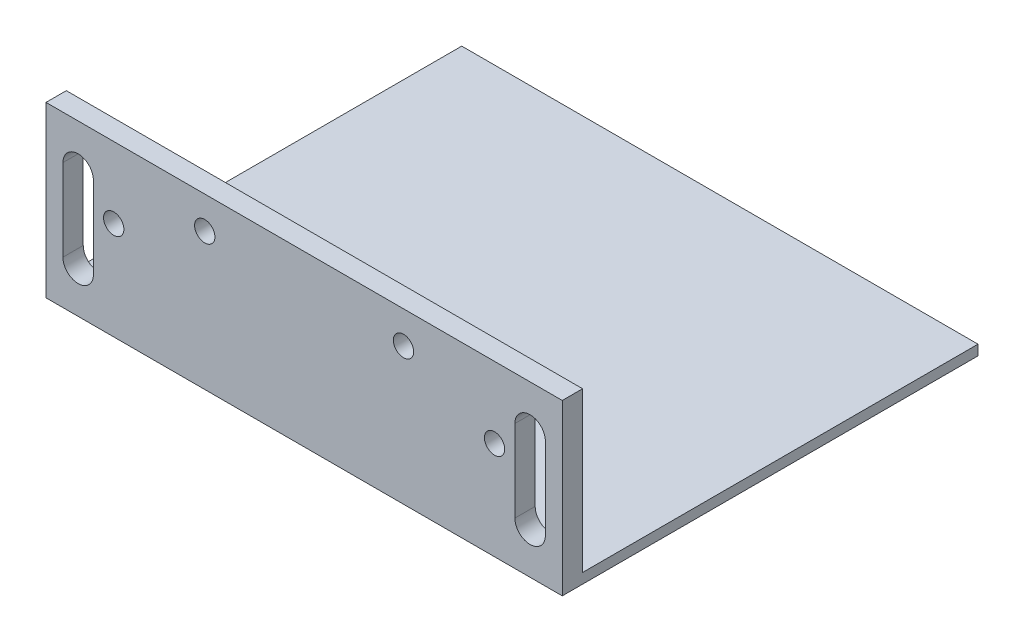
ISO-10303-21;
HEADER;
FILE_DESCRIPTION(('STEP AP214'),'2;1');
FILE_NAME('part.step','',(''),(''),'','','');
FILE_SCHEMA(('AUTOMOTIVE_DESIGN { 1 0 10303 214 1 1 1 1 }'));
ENDSEC;
DATA;
#1=APPLICATION_CONTEXT('core data for automotive mechanical design processes');
#2=APPLICATION_PROTOCOL_DEFINITION('international standard','automotive_design',2000,#1);
#3=PRODUCT_CONTEXT('',#1,'mechanical');
#4=PRODUCT('Part','Part','',(#3));
#5=PRODUCT_RELATED_PRODUCT_CATEGORY('part','',(#4));
#6=PRODUCT_DEFINITION_FORMATION('','',#4);
#7=PRODUCT_DEFINITION_CONTEXT('part definition',#1,'design');
#8=PRODUCT_DEFINITION('design','',#6,#7);
#9=PRODUCT_DEFINITION_SHAPE('','',#8);
#10=(LENGTH_UNIT() NAMED_UNIT(*) SI_UNIT(.MILLI.,.METRE.));
#11=(NAMED_UNIT(*) PLANE_ANGLE_UNIT() SI_UNIT($,.RADIAN.));
#12=(NAMED_UNIT(*) SI_UNIT($,.STERADIAN.) SOLID_ANGLE_UNIT());
#13=UNCERTAINTY_MEASURE_WITH_UNIT(LENGTH_MEASURE(1.E-05),#10,'distance_accuracy_value','');
#14=(GEOMETRIC_REPRESENTATION_CONTEXT(3) GLOBAL_UNCERTAINTY_ASSIGNED_CONTEXT((#13)) GLOBAL_UNIT_ASSIGNED_CONTEXT((#10,
#11,#12)) REPRESENTATION_CONTEXT('',''));
#15=CARTESIAN_POINT('',(0.,0.,0.));
#16=DIRECTION('',(0.,0.,1.));
#17=DIRECTION('',(1.,0.,0.));
#18=AXIS2_PLACEMENT_3D('',#15,#16,#17);
#19=CARTESIAN_POINT('',(-38.125,1.5,29.2));
#20=DIRECTION('',(1.,0.,0.));
#21=DIRECTION('',(0.,0.,-1.));
#22=AXIS2_PLACEMENT_3D('',#19,#20,#21);
#23=PLANE('',#22);
#24=DIRECTION('',(0.,0.,1.));
#25=VECTOR('',#24,1.);
#26=CARTESIAN_POINT('',(-38.125,0.,29.2));
#27=LINE('',#26,#25);
#28=CARTESIAN_POINT('',(-38.125,0.,-29.2));
#29=VERTEX_POINT('',#28);
#30=CARTESIAN_POINT('',(-38.125,0.,32.2));
#31=VERTEX_POINT('',#30);
#32=EDGE_CURVE('E247',#29,#31,#27,.T.);
#33=ORIENTED_EDGE('',*,*,#32,.T.);
#34=DIRECTION('',(0.,-1.,0.));
#35=VECTOR('',#34,1.);
#36=CARTESIAN_POINT('',(-38.125,0.,32.2));
#37=LINE('',#36,#35);
#38=CARTESIAN_POINT('',(-38.125,25.,32.2));
#39=VERTEX_POINT('',#38);
#40=EDGE_CURVE('E225',#39,#31,#37,.T.);
#41=ORIENTED_EDGE('',*,*,#40,.F.);
#42=DIRECTION('',(0.,0.,-1.));
#43=VECTOR('',#42,1.);
#44=CARTESIAN_POINT('',(-38.125,25.,32.2));
#45=LINE('',#44,#43);
#46=CARTESIAN_POINT('',(-38.125,25.,29.2));
#47=VERTEX_POINT('',#46);
#48=EDGE_CURVE('E236',#39,#47,#45,.T.);
#49=ORIENTED_EDGE('',*,*,#48,.T.);
#50=DIRECTION('',(0.,-1.,0.));
#51=VECTOR('',#50,1.);
#52=CARTESIAN_POINT('',(-38.125,0.,29.2));
#53=LINE('',#52,#51);
#54=CARTESIAN_POINT('',(-38.125,1.5,29.2));
#55=VERTEX_POINT('',#54);
#56=EDGE_CURVE('E224',#47,#55,#53,.T.);
#57=ORIENTED_EDGE('',*,*,#56,.T.);
#58=DIRECTION('',(0.,0.,1.));
#59=VECTOR('',#58,1.);
#60=CARTESIAN_POINT('',(-38.125,1.5,29.2));
#61=LINE('',#60,#59);
#62=CARTESIAN_POINT('',(-38.125,1.5,-29.2));
#63=VERTEX_POINT('',#62);
#64=EDGE_CURVE('E248',#63,#55,#61,.T.);
#65=ORIENTED_EDGE('',*,*,#64,.F.);
#66=DIRECTION('',(0.,-1.,0.));
#67=VECTOR('',#66,1.);
#68=CARTESIAN_POINT('',(-38.125,1.5,-29.2));
#69=LINE('',#68,#67);
#70=EDGE_CURVE('E43',#63,#29,#69,.T.);
#71=ORIENTED_EDGE('',*,*,#70,.T.);
#72=EDGE_LOOP('',(#33,#41,#49,#57,#65,#71));
#73=FACE_BOUND('',#72,.T.);
#74=ADVANCED_FACE('F36',(#73),#23,.F.);
#75=CARTESIAN_POINT('',(38.125,1.5,29.2));
#76=DIRECTION('',(-1.,0.,0.));
#77=DIRECTION('',(0.,0.,1.));
#78=AXIS2_PLACEMENT_3D('',#75,#76,#77);
#79=PLANE('',#78);
#80=DIRECTION('',(0.,0.,-1.));
#81=VECTOR('',#80,1.);
#82=CARTESIAN_POINT('',(38.125,0.,29.2));
#83=LINE('',#82,#81);
#84=CARTESIAN_POINT('',(38.125,0.,32.2));
#85=VERTEX_POINT('',#84);
#86=CARTESIAN_POINT('',(38.125,0.,-29.2));
#87=VERTEX_POINT('',#86);
#88=EDGE_CURVE('E260',#85,#87,#83,.T.);
#89=ORIENTED_EDGE('',*,*,#88,.T.);
#90=DIRECTION('',(0.,-1.,0.));
#91=VECTOR('',#90,1.);
#92=CARTESIAN_POINT('',(38.125,1.5,-29.2));
#93=LINE('',#92,#91);
#94=CARTESIAN_POINT('',(38.125,1.5,-29.2));
#95=VERTEX_POINT('',#94);
#96=EDGE_CURVE('E11',#95,#87,#93,.T.);
#97=ORIENTED_EDGE('',*,*,#96,.F.);
#98=DIRECTION('',(0.,0.,-1.));
#99=VECTOR('',#98,1.);
#100=CARTESIAN_POINT('',(38.125,1.5,29.2));
#101=LINE('',#100,#99);
#102=CARTESIAN_POINT('',(38.125,1.5,29.2));
#103=VERTEX_POINT('',#102);
#104=EDGE_CURVE('E255',#103,#95,#101,.T.);
#105=ORIENTED_EDGE('',*,*,#104,.F.);
#106=DIRECTION('',(0.,1.,0.));
#107=VECTOR('',#106,1.);
#108=CARTESIAN_POINT('',(38.125,0.,29.2));
#109=LINE('',#108,#107);
#110=CARTESIAN_POINT('',(38.125,25.,29.2));
#111=VERTEX_POINT('',#110);
#112=EDGE_CURVE('E239',#103,#111,#109,.T.);
#113=ORIENTED_EDGE('',*,*,#112,.T.);
#114=DIRECTION('',(0.,0.,-1.));
#115=VECTOR('',#114,1.);
#116=CARTESIAN_POINT('',(38.125,25.,32.2));
#117=LINE('',#116,#115);
#118=CARTESIAN_POINT('',(38.125,25.,32.2));
#119=VERTEX_POINT('',#118);
#120=EDGE_CURVE('E244',#119,#111,#117,.T.);
#121=ORIENTED_EDGE('',*,*,#120,.F.);
#122=DIRECTION('',(0.,1.,0.));
#123=VECTOR('',#122,1.);
#124=CARTESIAN_POINT('',(38.125,0.,32.2));
#125=LINE('',#124,#123);
#126=EDGE_CURVE('E232',#85,#119,#125,.T.);
#127=ORIENTED_EDGE('',*,*,#126,.F.);
#128=EDGE_LOOP('',(#89,#97,#105,#113,#121,#127));
#129=FACE_BOUND('',#128,.T.);
#130=ADVANCED_FACE('F288',(#129),#79,.F.);
#131=CARTESIAN_POINT('',(38.125,1.5,-29.2));
#132=DIRECTION('',(0.,0.,1.));
#133=DIRECTION('',(1.,0.,0.));
#134=AXIS2_PLACEMENT_3D('',#131,#132,#133);
#135=PLANE('',#134);
#136=DIRECTION('',(-1.,0.,0.));
#137=VECTOR('',#136,1.);
#138=CARTESIAN_POINT('',(38.125,0.,-29.2));
#139=LINE('',#138,#137);
#140=EDGE_CURVE('E252',#87,#29,#139,.T.);
#141=ORIENTED_EDGE('',*,*,#140,.T.);
#142=ORIENTED_EDGE('',*,*,#70,.F.);
#143=DIRECTION('',(-1.,0.,0.));
#144=VECTOR('',#143,1.);
#145=CARTESIAN_POINT('',(38.125,1.5,-29.2));
#146=LINE('',#145,#144);
#147=EDGE_CURVE('E257',#95,#63,#146,.T.);
#148=ORIENTED_EDGE('',*,*,#147,.F.);
#149=ORIENTED_EDGE('',*,*,#96,.T.);
#150=EDGE_LOOP('',(#141,#142,#148,#149));
#151=FACE_BOUND('',#150,.T.);
#152=ADVANCED_FACE('F290',(#151),#135,.F.);
#153=CARTESIAN_POINT('',(0.,1.5,0.));
#154=DIRECTION('',(0.,1.,0.));
#155=DIRECTION('',(0.,0.,1.));
#156=AXIS2_PLACEMENT_3D('',#153,#154,#155);
#157=PLANE('',#156);
#158=ORIENTED_EDGE('',*,*,#64,.T.);
#159=DIRECTION('',(1.,0.,0.));
#160=VECTOR('',#159,1.);
#161=CARTESIAN_POINT('',(38.125,1.5,29.2));
#162=LINE('',#161,#160);
#163=EDGE_CURVE('E251',#55,#103,#162,.T.);
#164=ORIENTED_EDGE('',*,*,#163,.T.);
#165=ORIENTED_EDGE('',*,*,#104,.T.);
#166=ORIENTED_EDGE('',*,*,#147,.T.);
#167=EDGE_LOOP('',(#158,#164,#165,#166));
#168=FACE_BOUND('',#167,.T.);
#169=ADVANCED_FACE('F285',(#168),#157,.T.);
#170=CARTESIAN_POINT('',(0.,0.,0.));
#171=DIRECTION('',(0.,1.,0.));
#172=DIRECTION('',(0.,0.,1.));
#173=AXIS2_PLACEMENT_3D('',#170,#171,#172);
#174=PLANE('',#173);
#175=ORIENTED_EDGE('',*,*,#32,.F.);
#176=ORIENTED_EDGE('',*,*,#140,.F.);
#177=ORIENTED_EDGE('',*,*,#88,.F.);
#178=DIRECTION('',(1.,0.,0.));
#179=VECTOR('',#178,1.);
#180=CARTESIAN_POINT('',(-38.125,0.,32.2));
#181=LINE('',#180,#179);
#182=EDGE_CURVE('E228',#31,#85,#181,.T.);
#183=ORIENTED_EDGE('',*,*,#182,.F.);
#184=EDGE_LOOP('',(#175,#176,#177,#183));
#185=FACE_BOUND('',#184,.T.);
#186=ADVANCED_FACE('F273',(#185),#174,.F.);
#187=CARTESIAN_POINT('',(0.,0.,29.2));
#188=DIRECTION('',(0.,0.,-1.));
#189=DIRECTION('',(-1.,0.,0.));
#190=AXIS2_PLACEMENT_3D('',#187,#188,#189);
#191=PLANE('',#190);
#192=DIRECTION('',(0.,1.,0.));
#193=VECTOR('',#192,1.);
#194=CARTESIAN_POINT('',(35.625,0.,29.2));
#195=LINE('',#194,#193);
#196=CARTESIAN_POINT('',(35.625,6.45,29.2));
#197=VERTEX_POINT('',#196);
#198=CARTESIAN_POINT('',(35.625,18.55,29.2));
#199=VERTEX_POINT('',#198);
#200=EDGE_CURVE('E177',#197,#199,#195,.T.);
#201=ORIENTED_EDGE('',*,*,#200,.T.);
#202=CARTESIAN_POINT('',(33.375,18.55,29.2));
#203=DIRECTION('',(0.,0.,-1.));
#204=DIRECTION('',(-1.,0.,0.));
#205=AXIS2_PLACEMENT_3D('',#202,#203,#204);
#206=CIRCLE('',#205,2.25);
#207=CARTESIAN_POINT('',(31.125,18.55,29.2));
#208=VERTEX_POINT('',#207);
#209=EDGE_CURVE('E180',#199,#208,#206,.F.);
#210=ORIENTED_EDGE('',*,*,#209,.T.);
#211=DIRECTION('',(0.,-1.,0.));
#212=VECTOR('',#211,1.);
#213=CARTESIAN_POINT('',(31.125,0.,29.2));
#214=LINE('',#213,#212);
#215=CARTESIAN_POINT('',(31.125,6.45,29.2));
#216=VERTEX_POINT('',#215);
#217=EDGE_CURVE('E174',#208,#216,#214,.T.);
#218=ORIENTED_EDGE('',*,*,#217,.T.);
#219=CARTESIAN_POINT('',(33.375,6.45,29.2));
#220=DIRECTION('',(0.,0.,-1.));
#221=DIRECTION('',(-1.,0.,0.));
#222=AXIS2_PLACEMENT_3D('',#219,#220,#221);
#223=CIRCLE('',#222,2.25);
#224=EDGE_CURVE('E142',#216,#197,#223,.F.);
#225=ORIENTED_EDGE('',*,*,#224,.T.);
#226=EDGE_LOOP('',(#201,#210,#218,#225));
#227=FACE_BOUND('',#226,.T.);
#228=CARTESIAN_POINT('',(14.6780891573291,20.2475518584753,29.2));
#229=DIRECTION('',(0.,0.,-1.));
#230=DIRECTION('',(-1.,0.,0.));
#231=AXIS2_PLACEMENT_3D('',#228,#229,#230);
#232=CIRCLE('',#231,1.5);
#233=CARTESIAN_POINT('',(13.1780891573291,20.2475518584753,29.2));
#234=VERTEX_POINT('',#233);
#235=EDGE_CURVE('E171',#234,#234,#232,.F.);
#236=ORIENTED_EDGE('',*,*,#235,.T.);
#237=EDGE_LOOP('',(#236));
#238=FACE_BOUND('',#237,.T.);
#239=CARTESIAN_POINT('',(28.125,14.5,29.2));
#240=DIRECTION('',(0.,0.,-1.));
#241=DIRECTION('',(-1.,0.,0.));
#242=AXIS2_PLACEMENT_3D('',#239,#240,#241);
#243=CIRCLE('',#242,1.5);
#244=CARTESIAN_POINT('',(26.625,14.5,29.2));
#245=VERTEX_POINT('',#244);
#246=EDGE_CURVE('E168',#245,#245,#243,.F.);
#247=ORIENTED_EDGE('',*,*,#246,.T.);
#248=EDGE_LOOP('',(#247));
#249=FACE_BOUND('',#248,.T.);
#250=CARTESIAN_POINT('',(-33.375,18.55,29.2));
#251=DIRECTION('',(0.,0.,-1.));
#252=DIRECTION('',(-1.,0.,0.));
#253=AXIS2_PLACEMENT_3D('',#250,#251,#252);
#254=CIRCLE('',#253,2.25);
#255=CARTESIAN_POINT('',(-35.625,18.55,29.2));
#256=VERTEX_POINT('',#255);
#257=CARTESIAN_POINT('',(-31.125,18.55,29.2));
#258=VERTEX_POINT('',#257);
#259=EDGE_CURVE('E222',#256,#258,#254,.T.);
#260=ORIENTED_EDGE('',*,*,#259,.F.);
#261=DIRECTION('',(0.,1.,0.));
#262=VECTOR('',#261,1.);
#263=CARTESIAN_POINT('',(-35.625,0.,29.2));
#264=LINE('',#263,#262);
#265=CARTESIAN_POINT('',(-35.625,6.45,29.2));
#266=VERTEX_POINT('',#265);
#267=EDGE_CURVE('E215',#266,#256,#264,.T.);
#268=ORIENTED_EDGE('',*,*,#267,.F.);
#269=CARTESIAN_POINT('',(-33.375,6.45,29.2));
#270=DIRECTION('',(0.,0.,-1.));
#271=DIRECTION('',(-1.,0.,0.));
#272=AXIS2_PLACEMENT_3D('',#269,#270,#271);
#273=CIRCLE('',#272,2.25);
#274=CARTESIAN_POINT('',(-31.125,6.45,29.2));
#275=VERTEX_POINT('',#274);
#276=EDGE_CURVE('E217',#275,#266,#273,.T.);
#277=ORIENTED_EDGE('',*,*,#276,.F.);
#278=DIRECTION('',(0.,-1.,0.));
#279=VECTOR('',#278,1.);
#280=CARTESIAN_POINT('',(-31.125,0.,29.2));
#281=LINE('',#280,#279);
#282=EDGE_CURVE('E220',#258,#275,#281,.T.);
#283=ORIENTED_EDGE('',*,*,#282,.F.);
#284=EDGE_LOOP('',(#260,#268,#277,#283));
#285=FACE_BOUND('',#284,.T.);
#286=CARTESIAN_POINT('',(-14.6780891573291,20.2475518584753,29.2));
#287=DIRECTION('',(0.,0.,-1.));
#288=DIRECTION('',(-1.,0.,0.));
#289=AXIS2_PLACEMENT_3D('',#286,#287,#288);
#290=CIRCLE('',#289,1.5);
#291=CARTESIAN_POINT('',(-16.1780891573291,20.2475518584753,29.2));
#292=VERTEX_POINT('',#291);
#293=EDGE_CURVE('E212',#292,#292,#290,.T.);
#294=ORIENTED_EDGE('',*,*,#293,.F.);
#295=EDGE_LOOP('',(#294));
#296=FACE_BOUND('',#295,.T.);
#297=CARTESIAN_POINT('',(-28.125,14.5,29.2));
#298=DIRECTION('',(0.,0.,-1.));
#299=DIRECTION('',(-1.,0.,0.));
#300=AXIS2_PLACEMENT_3D('',#297,#298,#299);
#301=CIRCLE('',#300,1.5);
#302=CARTESIAN_POINT('',(-29.625,14.5,29.2));
#303=VERTEX_POINT('',#302);
#304=EDGE_CURVE('E209',#303,#303,#301,.T.);
#305=ORIENTED_EDGE('',*,*,#304,.F.);
#306=EDGE_LOOP('',(#305));
#307=FACE_BOUND('',#306,.T.);
#308=ORIENTED_EDGE('',*,*,#163,.F.);
#309=ORIENTED_EDGE('',*,*,#56,.F.);
#310=DIRECTION('',(-1.,0.,0.));
#311=VECTOR('',#310,1.);
#312=CARTESIAN_POINT('',(-38.125,25.,29.2));
#313=LINE('',#312,#311);
#314=EDGE_CURVE('E229',#111,#47,#313,.T.);
#315=ORIENTED_EDGE('',*,*,#314,.F.);
#316=ORIENTED_EDGE('',*,*,#112,.F.);
#317=EDGE_LOOP('',(#308,#309,#315,#316));
#318=FACE_BOUND('',#317,.T.);
#319=ADVANCED_FACE('F282',(#227,#238,#249,#285,#296,#307,#318),#191,.T.);
#320=CARTESIAN_POINT('',(-38.125,25.,32.2));
#321=DIRECTION('',(0.,-1.,0.));
#322=DIRECTION('',(0.,0.,-1.));
#323=AXIS2_PLACEMENT_3D('',#320,#321,#322);
#324=PLANE('',#323);
#325=ORIENTED_EDGE('',*,*,#314,.T.);
#326=ORIENTED_EDGE('',*,*,#48,.F.);
#327=DIRECTION('',(-1.,0.,0.));
#328=VECTOR('',#327,1.);
#329=CARTESIAN_POINT('',(-38.125,25.,32.2));
#330=LINE('',#329,#328);
#331=EDGE_CURVE('E234',#119,#39,#330,.T.);
#332=ORIENTED_EDGE('',*,*,#331,.F.);
#333=ORIENTED_EDGE('',*,*,#120,.T.);
#334=EDGE_LOOP('',(#325,#326,#332,#333));
#335=FACE_BOUND('',#334,.T.);
#336=ADVANCED_FACE('F330',(#335),#324,.F.);
#337=CARTESIAN_POINT('',(0.,0.,32.2));
#338=DIRECTION('',(0.,0.,-1.));
#339=DIRECTION('',(-1.,0.,0.));
#340=AXIS2_PLACEMENT_3D('',#337,#338,#339);
#341=PLANE('',#340);
#342=CARTESIAN_POINT('',(33.375,18.55,32.2));
#343=DIRECTION('',(0.,0.,-1.));
#344=DIRECTION('',(-1.,0.,0.));
#345=AXIS2_PLACEMENT_3D('',#342,#343,#344);
#346=CIRCLE('',#345,2.25);
#347=CARTESIAN_POINT('',(31.125,18.55,32.2));
#348=VERTEX_POINT('',#347);
#349=CARTESIAN_POINT('',(35.625,18.55,32.2));
#350=VERTEX_POINT('',#349);
#351=EDGE_CURVE('E58',#348,#350,#346,.T.);
#352=ORIENTED_EDGE('',*,*,#351,.T.);
#353=DIRECTION('',(0.,-1.,0.));
#354=VECTOR('',#353,1.);
#355=CARTESIAN_POINT('',(35.625,18.55,32.2));
#356=LINE('',#355,#354);
#357=CARTESIAN_POINT('',(35.625,6.45,32.2));
#358=VERTEX_POINT('',#357);
#359=EDGE_CURVE('E155',#350,#358,#356,.T.);
#360=ORIENTED_EDGE('',*,*,#359,.T.);
#361=CARTESIAN_POINT('',(33.375,6.45,32.2));
#362=DIRECTION('',(0.,0.,-1.));
#363=DIRECTION('',(-1.,0.,0.));
#364=AXIS2_PLACEMENT_3D('',#361,#362,#363);
#365=CIRCLE('',#364,2.25);
#366=CARTESIAN_POINT('',(31.125,6.45,32.2));
#367=VERTEX_POINT('',#366);
#368=EDGE_CURVE('E139',#358,#367,#365,.T.);
#369=ORIENTED_EDGE('',*,*,#368,.T.);
#370=DIRECTION('',(0.,1.,0.));
#371=VECTOR('',#370,1.);
#372=CARTESIAN_POINT('',(31.125,18.55,32.2));
#373=LINE('',#372,#371);
#374=EDGE_CURVE('E148',#367,#348,#373,.T.);
#375=ORIENTED_EDGE('',*,*,#374,.T.);
#376=EDGE_LOOP('',(#352,#360,#369,#375));
#377=FACE_BOUND('',#376,.T.);
#378=CARTESIAN_POINT('',(14.6780891573291,20.2475518584753,32.2));
#379=DIRECTION('',(0.,0.,-1.));
#380=DIRECTION('',(-1.,0.,0.));
#381=AXIS2_PLACEMENT_3D('',#378,#379,#380);
#382=CIRCLE('',#381,1.5);
#383=CARTESIAN_POINT('',(13.1780891573291,20.2475518584753,32.2));
#384=VERTEX_POINT('',#383);
#385=EDGE_CURVE('E162',#384,#384,#382,.T.);
#386=ORIENTED_EDGE('',*,*,#385,.T.);
#387=EDGE_LOOP('',(#386));
#388=FACE_BOUND('',#387,.T.);
#389=CARTESIAN_POINT('',(28.125,14.5,32.2));
#390=DIRECTION('',(0.,0.,-1.));
#391=DIRECTION('',(-1.,0.,0.));
#392=AXIS2_PLACEMENT_3D('',#389,#390,#391);
#393=CIRCLE('',#392,1.5);
#394=CARTESIAN_POINT('',(26.625,14.5,32.2));
#395=VERTEX_POINT('',#394);
#396=EDGE_CURVE('E165',#395,#395,#393,.T.);
#397=ORIENTED_EDGE('',*,*,#396,.T.);
#398=EDGE_LOOP('',(#397));
#399=FACE_BOUND('',#398,.T.);
#400=DIRECTION('',(0.,-1.,0.));
#401=VECTOR('',#400,1.);
#402=CARTESIAN_POINT('',(-35.625,18.55,32.2));
#403=LINE('',#402,#401);
#404=CARTESIAN_POINT('',(-35.625,18.55,32.2));
#405=VERTEX_POINT('',#404);
#406=CARTESIAN_POINT('',(-35.625,6.45,32.2));
#407=VERTEX_POINT('',#406);
#408=EDGE_CURVE('E203',#405,#407,#403,.T.);
#409=ORIENTED_EDGE('',*,*,#408,.F.);
#410=CARTESIAN_POINT('',(-33.375,18.55,32.2));
#411=DIRECTION('',(0.,0.,1.));
#412=DIRECTION('',(1.,0.,0.));
#413=AXIS2_PLACEMENT_3D('',#410,#411,#412);
#414=CIRCLE('',#413,2.25);
#415=CARTESIAN_POINT('',(-31.125,18.55,32.2));
#416=VERTEX_POINT('',#415);
#417=EDGE_CURVE('E188',#416,#405,#414,.T.);
#418=ORIENTED_EDGE('',*,*,#417,.F.);
#419=DIRECTION('',(0.,1.,0.));
#420=VECTOR('',#419,1.);
#421=CARTESIAN_POINT('',(-31.125,18.55,32.2));
#422=LINE('',#421,#420);
#423=CARTESIAN_POINT('',(-31.125,6.45,32.2));
#424=VERTEX_POINT('',#423);
#425=EDGE_CURVE('E192',#424,#416,#422,.T.);
#426=ORIENTED_EDGE('',*,*,#425,.F.);
#427=CARTESIAN_POINT('',(-33.375,6.45,32.2));
#428=DIRECTION('',(0.,0.,1.));
#429=DIRECTION('',(1.,0.,0.));
#430=AXIS2_PLACEMENT_3D('',#427,#428,#429);
#431=CIRCLE('',#430,2.25);
#432=EDGE_CURVE('E200',#407,#424,#431,.T.);
#433=ORIENTED_EDGE('',*,*,#432,.F.);
#434=EDGE_LOOP('',(#409,#418,#426,#433));
#435=FACE_BOUND('',#434,.T.);
#436=CARTESIAN_POINT('',(-14.6780891573291,20.2475518584753,32.2));
#437=DIRECTION('',(0.,0.,1.));
#438=DIRECTION('',(1.,0.,0.));
#439=AXIS2_PLACEMENT_3D('',#436,#437,#438);
#440=CIRCLE('',#439,1.5);
#441=CARTESIAN_POINT('',(-13.1780891573291,20.2475518584753,32.2));
#442=VERTEX_POINT('',#441);
#443=EDGE_CURVE('E184',#442,#442,#440,.T.);
#444=ORIENTED_EDGE('',*,*,#443,.F.);
#445=EDGE_LOOP('',(#444));
#446=FACE_BOUND('',#445,.T.);
#447=CARTESIAN_POINT('',(-28.125,14.5,32.2));
#448=DIRECTION('',(0.,0.,1.));
#449=DIRECTION('',(1.,0.,0.));
#450=AXIS2_PLACEMENT_3D('',#447,#448,#449);
#451=CIRCLE('',#450,1.5);
#452=CARTESIAN_POINT('',(-26.625,14.5,32.2));
#453=VERTEX_POINT('',#452);
#454=EDGE_CURVE('E187',#453,#453,#451,.T.);
#455=ORIENTED_EDGE('',*,*,#454,.F.);
#456=EDGE_LOOP('',(#455));
#457=FACE_BOUND('',#456,.T.);
#458=ORIENTED_EDGE('',*,*,#40,.T.);
#459=ORIENTED_EDGE('',*,*,#182,.T.);
#460=ORIENTED_EDGE('',*,*,#126,.T.);
#461=ORIENTED_EDGE('',*,*,#331,.T.);
#462=EDGE_LOOP('',(#458,#459,#460,#461));
#463=FACE_BOUND('',#462,.T.);
#464=ADVANCED_FACE('F152',(#377,#388,#399,#435,#446,#457,#463),#341,.F.);
#465=CARTESIAN_POINT('',(-28.125,14.5,-29.2));
#466=DIRECTION('',(0.,0.,1.));
#467=DIRECTION('',(1.,0.,0.));
#468=AXIS2_PLACEMENT_3D('',#465,#466,#467);
#469=CYLINDRICAL_SURFACE('',#468,1.5);
#470=ORIENTED_EDGE('',*,*,#304,.T.);
#471=EDGE_LOOP('',(#470));
#472=FACE_BOUND('',#471,.T.);
#473=ORIENTED_EDGE('',*,*,#454,.T.);
#474=EDGE_LOOP('',(#473));
#475=FACE_BOUND('',#474,.T.);
#476=ADVANCED_FACE('F342',(#472,#475),#469,.F.);
#477=CARTESIAN_POINT('',(-14.6780891573291,20.2475518584753,-29.2));
#478=DIRECTION('',(0.,0.,1.));
#479=DIRECTION('',(1.,0.,0.));
#480=AXIS2_PLACEMENT_3D('',#477,#478,#479);
#481=CYLINDRICAL_SURFACE('',#480,1.5);
#482=ORIENTED_EDGE('',*,*,#293,.T.);
#483=EDGE_LOOP('',(#482));
#484=FACE_BOUND('',#483,.T.);
#485=ORIENTED_EDGE('',*,*,#443,.T.);
#486=EDGE_LOOP('',(#485));
#487=FACE_BOUND('',#486,.T.);
#488=ADVANCED_FACE('F347',(#484,#487),#481,.F.);
#489=CARTESIAN_POINT('',(-33.375,18.55,-29.2));
#490=DIRECTION('',(0.,0.,1.));
#491=DIRECTION('',(1.,0.,0.));
#492=AXIS2_PLACEMENT_3D('',#489,#490,#491);
#493=CYLINDRICAL_SURFACE('',#492,2.25);
#494=ORIENTED_EDGE('',*,*,#259,.T.);
#495=DIRECTION('',(0.,0.,1.));
#496=VECTOR('',#495,1.);
#497=CARTESIAN_POINT('',(-31.125,18.55,-29.2));
#498=LINE('',#497,#496);
#499=EDGE_CURVE('E183',#258,#416,#498,.T.);
#500=ORIENTED_EDGE('',*,*,#499,.T.);
#501=ORIENTED_EDGE('',*,*,#417,.T.);
#502=DIRECTION('',(0.,0.,1.));
#503=VECTOR('',#502,1.);
#504=CARTESIAN_POINT('',(-35.625,18.55,-29.2));
#505=LINE('',#504,#503);
#506=EDGE_CURVE('E189',#256,#405,#505,.T.);
#507=ORIENTED_EDGE('',*,*,#506,.F.);
#508=EDGE_LOOP('',(#494,#500,#501,#507));
#509=FACE_BOUND('',#508,.T.);
#510=ADVANCED_FACE('F358',(#509),#493,.F.);
#511=CARTESIAN_POINT('',(-31.125,18.55,-29.2));
#512=DIRECTION('',(1.,0.,0.));
#513=DIRECTION('',(0.,0.,-1.));
#514=AXIS2_PLACEMENT_3D('',#511,#512,#513);
#515=PLANE('',#514);
#516=ORIENTED_EDGE('',*,*,#282,.T.);
#517=DIRECTION('',(0.,0.,1.));
#518=VECTOR('',#517,1.);
#519=CARTESIAN_POINT('',(-31.125,6.45,-29.2));
#520=LINE('',#519,#518);
#521=EDGE_CURVE('E195',#275,#424,#520,.T.);
#522=ORIENTED_EDGE('',*,*,#521,.T.);
#523=ORIENTED_EDGE('',*,*,#425,.T.);
#524=ORIENTED_EDGE('',*,*,#499,.F.);
#525=EDGE_LOOP('',(#516,#522,#523,#524));
#526=FACE_BOUND('',#525,.T.);
#527=ADVANCED_FACE('F369',(#526),#515,.F.);
#528=CARTESIAN_POINT('',(-33.375,6.45,-29.2));
#529=DIRECTION('',(0.,0.,1.));
#530=DIRECTION('',(1.,0.,0.));
#531=AXIS2_PLACEMENT_3D('',#528,#529,#530);
#532=CYLINDRICAL_SURFACE('',#531,2.25);
#533=ORIENTED_EDGE('',*,*,#276,.T.);
#534=DIRECTION('',(0.,0.,1.));
#535=VECTOR('',#534,1.);
#536=CARTESIAN_POINT('',(-35.625,6.45,-29.2));
#537=LINE('',#536,#535);
#538=EDGE_CURVE('E193',#266,#407,#537,.T.);
#539=ORIENTED_EDGE('',*,*,#538,.T.);
#540=ORIENTED_EDGE('',*,*,#432,.T.);
#541=ORIENTED_EDGE('',*,*,#521,.F.);
#542=EDGE_LOOP('',(#533,#539,#540,#541));
#543=FACE_BOUND('',#542,.T.);
#544=ADVANCED_FACE('F380',(#543),#532,.F.);
#545=CARTESIAN_POINT('',(-35.625,18.55,-29.2));
#546=DIRECTION('',(-1.,0.,0.));
#547=DIRECTION('',(0.,0.,1.));
#548=AXIS2_PLACEMENT_3D('',#545,#546,#547);
#549=PLANE('',#548);
#550=ORIENTED_EDGE('',*,*,#267,.T.);
#551=ORIENTED_EDGE('',*,*,#506,.T.);
#552=ORIENTED_EDGE('',*,*,#408,.T.);
#553=ORIENTED_EDGE('',*,*,#538,.F.);
#554=EDGE_LOOP('',(#550,#551,#552,#553));
#555=FACE_BOUND('',#554,.T.);
#556=ADVANCED_FACE('F391',(#555),#549,.F.);
#557=CARTESIAN_POINT('',(28.125,14.5,-29.2));
#558=DIRECTION('',(0.,0.,1.));
#559=DIRECTION('',(1.,0.,0.));
#560=AXIS2_PLACEMENT_3D('',#557,#558,#559);
#561=CYLINDRICAL_SURFACE('',#560,1.5);
#562=ORIENTED_EDGE('',*,*,#246,.F.);
#563=EDGE_LOOP('',(#562));
#564=FACE_BOUND('',#563,.T.);
#565=ORIENTED_EDGE('',*,*,#396,.F.);
#566=EDGE_LOOP('',(#565));
#567=FACE_BOUND('',#566,.T.);
#568=ADVANCED_FACE('F402',(#564,#567),#561,.F.);
#569=CARTESIAN_POINT('',(14.6780891573291,20.2475518584753,-29.2));
#570=DIRECTION('',(0.,0.,1.));
#571=DIRECTION('',(1.,0.,0.));
#572=AXIS2_PLACEMENT_3D('',#569,#570,#571);
#573=CYLINDRICAL_SURFACE('',#572,1.5);
#574=ORIENTED_EDGE('',*,*,#235,.F.);
#575=EDGE_LOOP('',(#574));
#576=FACE_BOUND('',#575,.T.);
#577=ORIENTED_EDGE('',*,*,#385,.F.);
#578=EDGE_LOOP('',(#577));
#579=FACE_BOUND('',#578,.T.);
#580=ADVANCED_FACE('F428',(#576,#579),#573,.F.);
#581=CARTESIAN_POINT('',(33.375,18.55,-29.2));
#582=DIRECTION('',(0.,0.,1.));
#583=DIRECTION('',(1.,0.,0.));
#584=AXIS2_PLACEMENT_3D('',#581,#582,#583);
#585=CYLINDRICAL_SURFACE('',#584,2.25);
#586=DIRECTION('',(0.,0.,1.));
#587=VECTOR('',#586,1.);
#588=CARTESIAN_POINT('',(35.625,18.55,-29.2));
#589=LINE('',#588,#587);
#590=EDGE_CURVE('E160',#199,#350,#589,.T.);
#591=ORIENTED_EDGE('',*,*,#590,.T.);
#592=ORIENTED_EDGE('',*,*,#351,.F.);
#593=DIRECTION('',(0.,0.,1.));
#594=VECTOR('',#593,1.);
#595=CARTESIAN_POINT('',(31.125,18.55,-29.2));
#596=LINE('',#595,#594);
#597=EDGE_CURVE('E145',#208,#348,#596,.T.);
#598=ORIENTED_EDGE('',*,*,#597,.F.);
#599=ORIENTED_EDGE('',*,*,#209,.F.);
#600=EDGE_LOOP('',(#591,#592,#598,#599));
#601=FACE_BOUND('',#600,.T.);
#602=ADVANCED_FACE('F439',(#601),#585,.F.);
#603=CARTESIAN_POINT('',(35.625,18.55,-29.2));
#604=DIRECTION('',(-1.,0.,0.));
#605=DIRECTION('',(0.,0.,1.));
#606=AXIS2_PLACEMENT_3D('',#603,#604,#605);
#607=PLANE('',#606);
#608=DIRECTION('',(0.,0.,1.));
#609=VECTOR('',#608,1.);
#610=CARTESIAN_POINT('',(35.625,6.45,-29.2));
#611=LINE('',#610,#609);
#612=EDGE_CURVE('E144',#197,#358,#611,.T.);
#613=ORIENTED_EDGE('',*,*,#612,.T.);
#614=ORIENTED_EDGE('',*,*,#359,.F.);
#615=ORIENTED_EDGE('',*,*,#590,.F.);
#616=ORIENTED_EDGE('',*,*,#200,.F.);
#617=EDGE_LOOP('',(#613,#614,#615,#616));
#618=FACE_BOUND('',#617,.T.);
#619=ADVANCED_FACE('F450',(#618),#607,.T.);
#620=CARTESIAN_POINT('',(33.375,6.45,-29.2));
#621=DIRECTION('',(0.,0.,1.));
#622=DIRECTION('',(1.,0.,0.));
#623=AXIS2_PLACEMENT_3D('',#620,#621,#622);
#624=CYLINDRICAL_SURFACE('',#623,2.25);
#625=DIRECTION('',(0.,0.,1.));
#626=VECTOR('',#625,1.);
#627=CARTESIAN_POINT('',(31.125,6.45,-29.2));
#628=LINE('',#627,#626);
#629=EDGE_CURVE('E50',#216,#367,#628,.T.);
#630=ORIENTED_EDGE('',*,*,#629,.T.);
#631=ORIENTED_EDGE('',*,*,#368,.F.);
#632=ORIENTED_EDGE('',*,*,#612,.F.);
#633=ORIENTED_EDGE('',*,*,#224,.F.);
#634=EDGE_LOOP('',(#630,#631,#632,#633));
#635=FACE_BOUND('',#634,.T.);
#636=ADVANCED_FACE('F136',(#635),#624,.F.);
#637=CARTESIAN_POINT('',(31.125,18.55,-29.2));
#638=DIRECTION('',(1.,0.,0.));
#639=DIRECTION('',(0.,0.,-1.));
#640=AXIS2_PLACEMENT_3D('',#637,#638,#639);
#641=PLANE('',#640);
#642=ORIENTED_EDGE('',*,*,#597,.T.);
#643=ORIENTED_EDGE('',*,*,#374,.F.);
#644=ORIENTED_EDGE('',*,*,#629,.F.);
#645=ORIENTED_EDGE('',*,*,#217,.F.);
#646=EDGE_LOOP('',(#642,#643,#644,#645));
#647=FACE_BOUND('',#646,.T.);
#648=ADVANCED_FACE('F149',(#647),#641,.T.);
#649=CLOSED_SHELL('',(#74,#130,#152,#169,#186,#319,#336,#464,#476,#488,#510,#527,#544,#556,#568,
#580,#602,#619,#636,#648));
#650=MANIFOLD_SOLID_BREP('B2',#649);
#651=ADVANCED_BREP_SHAPE_REPRESENTATION('',(#18,#650),#14);
#652=SHAPE_DEFINITION_REPRESENTATION(#9,#651);
ENDSEC;
END-ISO-10303-21;
